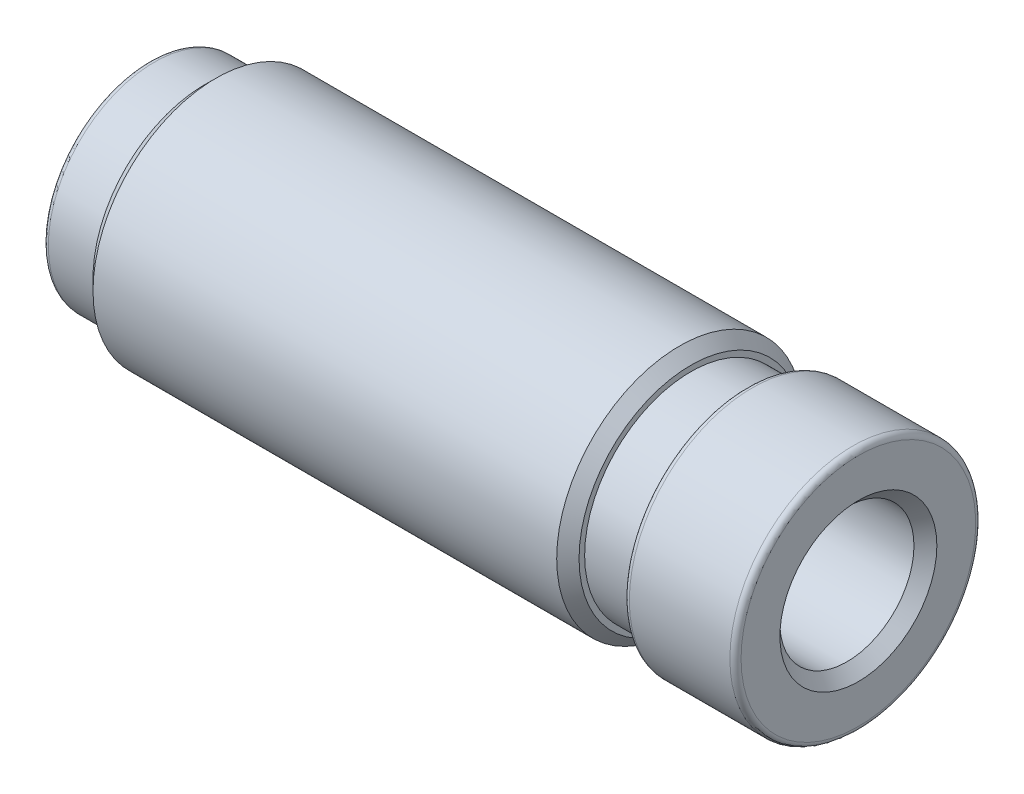
ISO-10303-21;
HEADER;
FILE_DESCRIPTION(('STEP AP214'),'2;1');
FILE_NAME('part.step','',(''),(''),'','','');
FILE_SCHEMA(('AUTOMOTIVE_DESIGN { 1 0 10303 214 1 1 1 1 }'));
ENDSEC;
DATA;
#1=APPLICATION_CONTEXT('core data for automotive mechanical design processes');
#2=APPLICATION_PROTOCOL_DEFINITION('international standard','automotive_design',2000,#1);
#3=PRODUCT_CONTEXT('',#1,'mechanical');
#4=PRODUCT('Part','Part','',(#3));
#5=PRODUCT_RELATED_PRODUCT_CATEGORY('part','',(#4));
#6=PRODUCT_DEFINITION_FORMATION('','',#4);
#7=PRODUCT_DEFINITION_CONTEXT('part definition',#1,'design');
#8=PRODUCT_DEFINITION('design','',#6,#7);
#9=PRODUCT_DEFINITION_SHAPE('','',#8);
#10=(LENGTH_UNIT() NAMED_UNIT(*) SI_UNIT(.MILLI.,.METRE.));
#11=(NAMED_UNIT(*) PLANE_ANGLE_UNIT() SI_UNIT($,.RADIAN.));
#12=(NAMED_UNIT(*) SI_UNIT($,.STERADIAN.) SOLID_ANGLE_UNIT());
#13=UNCERTAINTY_MEASURE_WITH_UNIT(LENGTH_MEASURE(1.E-05),#10,'distance_accuracy_value','');
#14=(GEOMETRIC_REPRESENTATION_CONTEXT(3) GLOBAL_UNCERTAINTY_ASSIGNED_CONTEXT((#13)) GLOBAL_UNIT_ASSIGNED_CONTEXT((#10,
#11,#12)) REPRESENTATION_CONTEXT('',''));
#15=CARTESIAN_POINT('',(0.,0.,0.));
#16=DIRECTION('',(0.,0.,1.));
#17=DIRECTION('',(1.,0.,0.));
#18=AXIS2_PLACEMENT_3D('',#15,#16,#17);
#19=CARTESIAN_POINT('',(0.,9.5,0.));
#20=DIRECTION('',(1.,0.,0.));
#21=DIRECTION('',(0.,0.,-1.));
#22=AXIS2_PLACEMENT_3D('',#19,#20,#21);
#23=PLANE('',#22);
#24=CARTESIAN_POINT('',(0.,0.,0.));
#25=DIRECTION('',(1.,0.,0.));
#26=DIRECTION('',(0.,0.,-1.));
#27=AXIS2_PLACEMENT_3D('',#24,#25,#26);
#28=CIRCLE('',#27,5.20000000000001);
#29=CARTESIAN_POINT('',(0.,0.,-5.20000000000001));
#30=VERTEX_POINT('',#29);
#31=EDGE_CURVE('E61',#30,#30,#28,.T.);
#32=ORIENTED_EDGE('',*,*,#31,.T.);
#33=EDGE_LOOP('',(#32));
#34=FACE_BOUND('',#33,.T.);
#35=CARTESIAN_POINT('',(0.,0.,0.));
#36=DIRECTION('',(1.,0.,0.));
#37=DIRECTION('',(0.,0.,-1.));
#38=AXIS2_PLACEMENT_3D('',#35,#36,#37);
#39=CIRCLE('',#38,9.);
#40=CARTESIAN_POINT('',(0.,0.,-9.));
#41=VERTEX_POINT('',#40);
#42=EDGE_CURVE('E64',#41,#41,#39,.F.);
#43=ORIENTED_EDGE('',*,*,#42,.T.);
#44=EDGE_LOOP('',(#43));
#45=FACE_BOUND('',#44,.T.);
#46=ADVANCED_FACE('F38',(#34,#45),#23,.F.);
#47=CARTESIAN_POINT('',(63.5,0.,0.));
#48=DIRECTION('',(-1.,0.,0.));
#49=DIRECTION('',(0.,0.,1.));
#50=AXIS2_PLACEMENT_3D('',#47,#48,#49);
#51=PLANE('',#50);
#52=CARTESIAN_POINT('',(63.5,0.,0.));
#53=DIRECTION('',(-1.,0.,0.));
#54=DIRECTION('',(0.,0.,1.));
#55=AXIS2_PLACEMENT_3D('',#52,#53,#54);
#56=CIRCLE('',#55,10.5);
#57=CARTESIAN_POINT('',(63.5,0.,10.5));
#58=VERTEX_POINT('',#57);
#59=EDGE_CURVE('E10',#58,#58,#56,.F.);
#60=ORIENTED_EDGE('',*,*,#59,.T.);
#61=EDGE_LOOP('',(#60));
#62=FACE_BOUND('',#61,.T.);
#63=CARTESIAN_POINT('',(63.5,0.,0.));
#64=DIRECTION('',(1.,0.,0.));
#65=DIRECTION('',(0.,0.,-1.));
#66=AXIS2_PLACEMENT_3D('',#63,#64,#65);
#67=CIRCLE('',#66,7.025);
#68=CARTESIAN_POINT('',(63.5,0.,-7.025));
#69=VERTEX_POINT('',#68);
#70=EDGE_CURVE('E97',#69,#69,#67,.T.);
#71=ORIENTED_EDGE('',*,*,#70,.F.);
#72=EDGE_LOOP('',(#71));
#73=FACE_BOUND('',#72,.T.);
#74=ADVANCED_FACE('F124',(#62,#73),#51,.F.);
#75=CARTESIAN_POINT('',(0.,0.,0.));
#76=DIRECTION('',(-1.,0.,0.));
#77=DIRECTION('',(0.,0.,1.));
#78=AXIS2_PLACEMENT_3D('',#75,#76,#77);
#79=CYLINDRICAL_SURFACE('',#78,11.);
#80=CARTESIAN_POINT('',(54.,0.,0.));
#81=DIRECTION('',(1.,0.,0.));
#82=DIRECTION('',(0.,0.,-1.));
#83=AXIS2_PLACEMENT_3D('',#80,#81,#82);
#84=CIRCLE('',#83,11.);
#85=CARTESIAN_POINT('',(54.,0.,-11.));
#86=VERTEX_POINT('',#85);
#87=EDGE_CURVE('E45',#86,#86,#84,.T.);
#88=ORIENTED_EDGE('',*,*,#87,.T.);
#89=EDGE_LOOP('',(#88));
#90=FACE_BOUND('',#89,.T.);
#91=CARTESIAN_POINT('',(63.,0.,0.));
#92=DIRECTION('',(-1.,0.,0.));
#93=DIRECTION('',(0.,0.,1.));
#94=AXIS2_PLACEMENT_3D('',#91,#92,#93);
#95=CIRCLE('',#94,11.);
#96=CARTESIAN_POINT('',(63.,0.,11.));
#97=VERTEX_POINT('',#96);
#98=EDGE_CURVE('E49',#97,#97,#95,.T.);
#99=ORIENTED_EDGE('',*,*,#98,.T.);
#100=EDGE_LOOP('',(#99));
#101=FACE_BOUND('',#100,.T.);
#102=ADVANCED_FACE('F130',(#90,#101),#79,.T.);
#103=CARTESIAN_POINT('',(53.5,11.,0.));
#104=DIRECTION('',(1.,0.,0.));
#105=DIRECTION('',(0.,0.,-1.));
#106=AXIS2_PLACEMENT_3D('',#103,#104,#105);
#107=PLANE('',#106);
#108=CARTESIAN_POINT('',(53.5,0.,0.));
#109=DIRECTION('',(1.,0.,0.));
#110=DIRECTION('',(0.,0.,-1.));
#111=AXIS2_PLACEMENT_3D('',#108,#109,#110);
#112=CIRCLE('',#111,10.5);
#113=CARTESIAN_POINT('',(53.5,0.,-10.5));
#114=VERTEX_POINT('',#113);
#115=EDGE_CURVE('E53',#114,#114,#112,.F.);
#116=ORIENTED_EDGE('',*,*,#115,.T.);
#117=EDGE_LOOP('',(#116));
#118=FACE_BOUND('',#117,.T.);
#119=CARTESIAN_POINT('',(53.5,0.,0.));
#120=DIRECTION('',(-1.,0.,0.));
#121=DIRECTION('',(0.,0.,1.));
#122=AXIS2_PLACEMENT_3D('',#119,#120,#121);
#123=CIRCLE('',#122,9.5);
#124=CARTESIAN_POINT('',(53.5,0.,9.5));
#125=VERTEX_POINT('',#124);
#126=EDGE_CURVE('E82',#125,#125,#123,.T.);
#127=ORIENTED_EDGE('',*,*,#126,.F.);
#128=EDGE_LOOP('',(#127));
#129=FACE_BOUND('',#128,.T.);
#130=ADVANCED_FACE('F155',(#118,#129),#107,.F.);
#131=CARTESIAN_POINT('',(0.,0.,0.));
#132=DIRECTION('',(-1.,0.,0.));
#133=DIRECTION('',(0.,0.,1.));
#134=AXIS2_PLACEMENT_3D('',#131,#132,#133);
#135=CYLINDRICAL_SURFACE('',#134,9.5);
#136=CARTESIAN_POINT('',(48.5,0.,0.));
#137=DIRECTION('',(-1.,0.,0.));
#138=DIRECTION('',(0.,0.,1.));
#139=AXIS2_PLACEMENT_3D('',#136,#137,#138);
#140=CIRCLE('',#139,9.5);
#141=CARTESIAN_POINT('',(48.5,0.,9.5));
#142=VERTEX_POINT('',#141);
#143=EDGE_CURVE('E85',#142,#142,#140,.T.);
#144=ORIENTED_EDGE('',*,*,#143,.F.);
#145=EDGE_LOOP('',(#144));
#146=FACE_BOUND('',#145,.T.);
#147=ORIENTED_EDGE('',*,*,#126,.T.);
#148=EDGE_LOOP('',(#147));
#149=FACE_BOUND('',#148,.T.);
#150=ADVANCED_FACE('F158',(#146,#149),#135,.T.);
#151=CARTESIAN_POINT('',(48.5,9.5,0.));
#152=DIRECTION('',(-1.,0.,0.));
#153=DIRECTION('',(0.,0.,1.));
#154=AXIS2_PLACEMENT_3D('',#151,#152,#153);
#155=PLANE('',#154);
#156=CARTESIAN_POINT('',(48.5,0.,0.));
#157=DIRECTION('',(-1.,0.,0.));
#158=DIRECTION('',(0.,0.,1.));
#159=AXIS2_PLACEMENT_3D('',#156,#157,#158);
#160=CIRCLE('',#159,9.99999999999999);
#161=CARTESIAN_POINT('',(48.5,0.,9.99999999999999));
#162=VERTEX_POINT('',#161);
#163=EDGE_CURVE('E73',#162,#162,#160,.F.);
#164=ORIENTED_EDGE('',*,*,#163,.T.);
#165=EDGE_LOOP('',(#164));
#166=FACE_BOUND('',#165,.T.);
#167=ORIENTED_EDGE('',*,*,#143,.T.);
#168=EDGE_LOOP('',(#167));
#169=FACE_BOUND('',#168,.T.);
#170=ADVANCED_FACE('F163',(#166,#169),#155,.F.);
#171=CARTESIAN_POINT('',(0.,0.,0.));
#172=DIRECTION('',(-1.,0.,0.));
#173=DIRECTION('',(0.,0.,1.));
#174=AXIS2_PLACEMENT_3D('',#171,#172,#173);
#175=CYLINDRICAL_SURFACE('',#174,11.);
#176=CARTESIAN_POINT('',(47.5,0.,0.));
#177=DIRECTION('',(-1.,0.,0.));
#178=DIRECTION('',(0.,0.,1.));
#179=AXIS2_PLACEMENT_3D('',#176,#177,#178);
#180=CIRCLE('',#179,11.);
#181=CARTESIAN_POINT('',(47.5,0.,11.));
#182=VERTEX_POINT('',#181);
#183=EDGE_CURVE('E76',#182,#182,#180,.T.);
#184=ORIENTED_EDGE('',*,*,#183,.T.);
#185=EDGE_LOOP('',(#184));
#186=FACE_BOUND('',#185,.T.);
#187=CARTESIAN_POINT('',(6.00000000000001,0.,0.));
#188=DIRECTION('',(1.,0.,0.));
#189=DIRECTION('',(0.,0.,-1.));
#190=AXIS2_PLACEMENT_3D('',#187,#188,#189);
#191=CIRCLE('',#190,11.);
#192=CARTESIAN_POINT('',(6.00000000000001,0.,-11.));
#193=VERTEX_POINT('',#192);
#194=EDGE_CURVE('E79',#193,#193,#191,.T.);
#195=ORIENTED_EDGE('',*,*,#194,.T.);
#196=EDGE_LOOP('',(#195));
#197=FACE_BOUND('',#196,.T.);
#198=ADVANCED_FACE('F169',(#186,#197),#175,.T.);
#199=CARTESIAN_POINT('',(5.,11.,0.));
#200=DIRECTION('',(1.,0.,0.));
#201=DIRECTION('',(0.,0.,-1.));
#202=AXIS2_PLACEMENT_3D('',#199,#200,#201);
#203=PLANE('',#202);
#204=CARTESIAN_POINT('',(5.,0.,0.));
#205=DIRECTION('',(1.,0.,0.));
#206=DIRECTION('',(0.,0.,-1.));
#207=AXIS2_PLACEMENT_3D('',#204,#205,#206);
#208=CIRCLE('',#207,9.99999999999999);
#209=CARTESIAN_POINT('',(5.,0.,-9.99999999999999));
#210=VERTEX_POINT('',#209);
#211=EDGE_CURVE('E70',#210,#210,#208,.F.);
#212=ORIENTED_EDGE('',*,*,#211,.T.);
#213=EDGE_LOOP('',(#212));
#214=FACE_BOUND('',#213,.T.);
#215=CARTESIAN_POINT('',(5.,0.,0.));
#216=DIRECTION('',(-1.,0.,0.));
#217=DIRECTION('',(0.,0.,1.));
#218=AXIS2_PLACEMENT_3D('',#215,#216,#217);
#219=CIRCLE('',#218,9.5);
#220=CARTESIAN_POINT('',(5.,0.,9.5));
#221=VERTEX_POINT('',#220);
#222=EDGE_CURVE('E88',#221,#221,#219,.T.);
#223=ORIENTED_EDGE('',*,*,#222,.F.);
#224=EDGE_LOOP('',(#223));
#225=FACE_BOUND('',#224,.T.);
#226=ADVANCED_FACE('F197',(#214,#225),#203,.F.);
#227=CARTESIAN_POINT('',(0.,0.,0.));
#228=DIRECTION('',(-1.,0.,0.));
#229=DIRECTION('',(0.,0.,1.));
#230=AXIS2_PLACEMENT_3D('',#227,#228,#229);
#231=CYLINDRICAL_SURFACE('',#230,9.5);
#232=CARTESIAN_POINT('',(0.5,0.,0.));
#233=DIRECTION('',(1.,0.,0.));
#234=DIRECTION('',(0.,0.,-1.));
#235=AXIS2_PLACEMENT_3D('',#232,#233,#234);
#236=CIRCLE('',#235,9.5);
#237=CARTESIAN_POINT('',(0.5,0.,-9.5));
#238=VERTEX_POINT('',#237);
#239=EDGE_CURVE('E58',#238,#238,#236,.T.);
#240=ORIENTED_EDGE('',*,*,#239,.T.);
#241=EDGE_LOOP('',(#240));
#242=FACE_BOUND('',#241,.T.);
#243=ORIENTED_EDGE('',*,*,#222,.T.);
#244=EDGE_LOOP('',(#243));
#245=FACE_BOUND('',#244,.T.);
#246=ADVANCED_FACE('F193',(#242,#245),#231,.T.);
#247=CARTESIAN_POINT('',(10.,0.,0.));
#248=DIRECTION('',(1.,0.,0.));
#249=DIRECTION('',(0.,0.,-1.));
#250=AXIS2_PLACEMENT_3D('',#247,#248,#249);
#251=CONICAL_SURFACE('',#250,5.99999999999999,1.02974425867665);
#252=CARTESIAN_POINT('',(9.21888119526418,0.,0.));
#253=DIRECTION('',(1.,0.,0.));
#254=DIRECTION('',(0.,0.,-1.));
#255=AXIS2_PLACEMENT_3D('',#252,#253,#254);
#256=CIRCLE('',#255,4.70000000000001);
#257=CARTESIAN_POINT('',(9.21888119526418,0.,-4.70000000000001));
#258=VERTEX_POINT('',#257);
#259=EDGE_CURVE('E100',#258,#258,#256,.F.);
#260=ORIENTED_EDGE('',*,*,#259,.T.);
#261=EDGE_LOOP('',(#260));
#262=FACE_BOUND('',#261,.T.);
#263=CARTESIAN_POINT('',(10.,0.,0.));
#264=DIRECTION('',(1.,0.,0.));
#265=DIRECTION('',(0.,0.,-1.));
#266=AXIS2_PLACEMENT_3D('',#263,#264,#265);
#267=CIRCLE('',#266,5.99999999999999);
#268=CARTESIAN_POINT('',(10.,0.,-5.99999999999999));
#269=VERTEX_POINT('',#268);
#270=EDGE_CURVE('E91',#269,#269,#267,.T.);
#271=ORIENTED_EDGE('',*,*,#270,.T.);
#272=EDGE_LOOP('',(#271));
#273=FACE_BOUND('',#272,.T.);
#274=ADVANCED_FACE('F104',(#262,#273),#251,.F.);
#275=CARTESIAN_POINT('',(63.5,0.,0.));
#276=DIRECTION('',(1.,0.,0.));
#277=DIRECTION('',(0.,0.,-1.));
#278=AXIS2_PLACEMENT_3D('',#275,#276,#277);
#279=CYLINDRICAL_SURFACE('',#278,5.99999999999999);
#280=ORIENTED_EDGE('',*,*,#270,.F.);
#281=EDGE_LOOP('',(#280));
#282=FACE_BOUND('',#281,.T.);
#283=CARTESIAN_POINT('',(62.475,0.,0.));
#284=DIRECTION('',(1.,0.,0.));
#285=DIRECTION('',(0.,0.,-1.));
#286=AXIS2_PLACEMENT_3D('',#283,#284,#285);
#287=CIRCLE('',#286,5.99999999999999);
#288=CARTESIAN_POINT('',(62.475,0.,-5.99999999999999));
#289=VERTEX_POINT('',#288);
#290=EDGE_CURVE('E94',#289,#289,#287,.T.);
#291=ORIENTED_EDGE('',*,*,#290,.T.);
#292=EDGE_LOOP('',(#291));
#293=FACE_BOUND('',#292,.T.);
#294=ADVANCED_FACE('F120',(#282,#293),#279,.F.);
#295=CARTESIAN_POINT('',(63.5,0.,0.));
#296=DIRECTION('',(1.,0.,0.));
#297=DIRECTION('',(0.,0.,-1.));
#298=AXIS2_PLACEMENT_3D('',#295,#296,#297);
#299=CONICAL_SURFACE('',#298,7.025,0.785398163397452);
#300=ORIENTED_EDGE('',*,*,#290,.F.);
#301=EDGE_LOOP('',(#300));
#302=FACE_BOUND('',#301,.T.);
#303=ORIENTED_EDGE('',*,*,#70,.T.);
#304=EDGE_LOOP('',(#303));
#305=FACE_BOUND('',#304,.T.);
#306=ADVANCED_FACE('F110',(#302,#305),#299,.F.);
#307=CARTESIAN_POINT('',(0.,0.,0.));
#308=DIRECTION('',(-1.,0.,0.));
#309=DIRECTION('',(0.,0.,1.));
#310=AXIS2_PLACEMENT_3D('',#307,#308,#309);
#311=CYLINDRICAL_SURFACE('',#310,4.70000000000001);
#312=CARTESIAN_POINT('',(0.5,0.,0.));
#313=DIRECTION('',(1.,0.,0.));
#314=DIRECTION('',(0.,0.,-1.));
#315=AXIS2_PLACEMENT_3D('',#312,#313,#314);
#316=CIRCLE('',#315,4.70000000000001);
#317=CARTESIAN_POINT('',(0.5,0.,-4.70000000000001));
#318=VERTEX_POINT('',#317);
#319=EDGE_CURVE('E67',#318,#318,#316,.F.);
#320=ORIENTED_EDGE('',*,*,#319,.T.);
#321=EDGE_LOOP('',(#320));
#322=FACE_BOUND('',#321,.T.);
#323=ORIENTED_EDGE('',*,*,#259,.F.);
#324=EDGE_LOOP('',(#323));
#325=FACE_BOUND('',#324,.T.);
#326=ADVANCED_FACE('F107',(#322,#325),#311,.F.);
#327=CARTESIAN_POINT('',(47.5,0.,0.));
#328=DIRECTION('',(-1.,0.,0.));
#329=DIRECTION('',(0.,0.,1.));
#330=AXIS2_PLACEMENT_3D('',#327,#328,#329);
#331=CONICAL_SURFACE('',#330,11.,0.785398163397452);
#332=ORIENTED_EDGE('',*,*,#163,.F.);
#333=EDGE_LOOP('',(#332));
#334=FACE_BOUND('',#333,.T.);
#335=ORIENTED_EDGE('',*,*,#183,.F.);
#336=EDGE_LOOP('',(#335));
#337=FACE_BOUND('',#336,.T.);
#338=ADVANCED_FACE('F109',(#334,#337),#331,.T.);
#339=CARTESIAN_POINT('',(5.,0.,0.));
#340=DIRECTION('',(1.,0.,0.));
#341=DIRECTION('',(0.,0.,-1.));
#342=AXIS2_PLACEMENT_3D('',#339,#340,#341);
#343=CONICAL_SURFACE('',#342,9.99999999999999,0.785398163397447);
#344=ORIENTED_EDGE('',*,*,#194,.F.);
#345=EDGE_LOOP('',(#344));
#346=FACE_BOUND('',#345,.T.);
#347=ORIENTED_EDGE('',*,*,#211,.F.);
#348=EDGE_LOOP('',(#347));
#349=FACE_BOUND('',#348,.T.);
#350=ADVANCED_FACE('F117',(#346,#349),#343,.T.);
#351=CARTESIAN_POINT('',(0.5,0.,0.));
#352=DIRECTION('',(1.,0.,0.));
#353=DIRECTION('',(0.,0.,-1.));
#354=AXIS2_PLACEMENT_3D('',#351,#352,#353);
#355=TOROIDAL_SURFACE('',#354,5.20000000000001,0.5);
#356=ORIENTED_EDGE('',*,*,#31,.F.);
#357=EDGE_LOOP('',(#356));
#358=FACE_BOUND('',#357,.T.);
#359=ORIENTED_EDGE('',*,*,#319,.F.);
#360=EDGE_LOOP('',(#359));
#361=FACE_BOUND('',#360,.T.);
#362=ADVANCED_FACE('F137',(#358,#361),#355,.T.);
#363=CARTESIAN_POINT('',(0.5,0.,0.));
#364=DIRECTION('',(1.,0.,0.));
#365=DIRECTION('',(0.,0.,-1.));
#366=AXIS2_PLACEMENT_3D('',#363,#364,#365);
#367=TOROIDAL_SURFACE('',#366,9.,0.5);
#368=ORIENTED_EDGE('',*,*,#239,.F.);
#369=EDGE_LOOP('',(#368));
#370=FACE_BOUND('',#369,.T.);
#371=ORIENTED_EDGE('',*,*,#42,.F.);
#372=EDGE_LOOP('',(#371));
#373=FACE_BOUND('',#372,.T.);
#374=ADVANCED_FACE('F141',(#370,#373),#367,.T.);
#375=CARTESIAN_POINT('',(54.,0.,0.));
#376=DIRECTION('',(1.,0.,0.));
#377=DIRECTION('',(0.,0.,-1.));
#378=AXIS2_PLACEMENT_3D('',#375,#376,#377);
#379=TOROIDAL_SURFACE('',#378,10.5,0.5);
#380=ORIENTED_EDGE('',*,*,#87,.F.);
#381=EDGE_LOOP('',(#380));
#382=FACE_BOUND('',#381,.T.);
#383=ORIENTED_EDGE('',*,*,#115,.F.);
#384=EDGE_LOOP('',(#383));
#385=FACE_BOUND('',#384,.T.);
#386=ADVANCED_FACE('F144',(#382,#385),#379,.T.);
#387=CARTESIAN_POINT('',(63.,0.,0.));
#388=DIRECTION('',(-1.,0.,0.));
#389=DIRECTION('',(0.,0.,1.));
#390=AXIS2_PLACEMENT_3D('',#387,#388,#389);
#391=TOROIDAL_SURFACE('',#390,10.5,0.5);
#392=ORIENTED_EDGE('',*,*,#59,.F.);
#393=EDGE_LOOP('',(#392));
#394=FACE_BOUND('',#393,.T.);
#395=ORIENTED_EDGE('',*,*,#98,.F.);
#396=EDGE_LOOP('',(#395));
#397=FACE_BOUND('',#396,.T.);
#398=ADVANCED_FACE('F40',(#394,#397),#391,.T.);
#399=CLOSED_SHELL('',(#46,#74,#102,#130,#150,#170,#198,#226,#246,#274,#294,#306,#326,#338,#350,
#362,#374,#386,#398));
#400=MANIFOLD_SOLID_BREP('B2',#399);
#401=ADVANCED_BREP_SHAPE_REPRESENTATION('',(#18,#400),#14);
#402=SHAPE_DEFINITION_REPRESENTATION(#9,#401);
ENDSEC;
END-ISO-10303-21;
